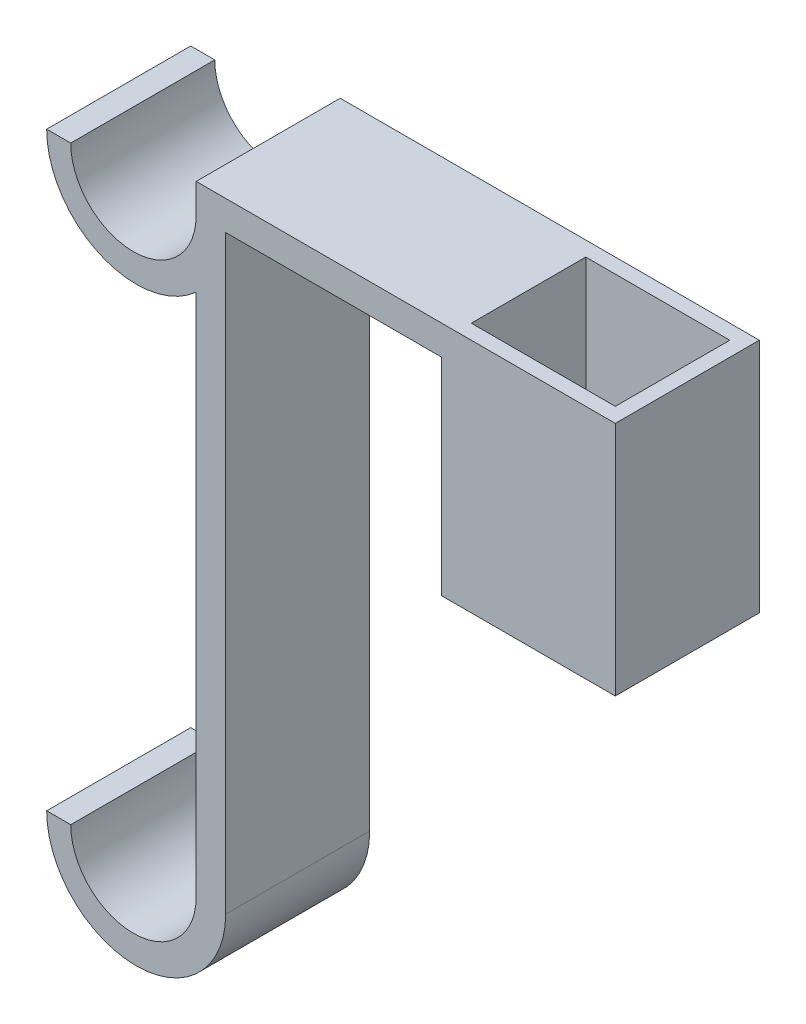
ISO-10303-21;
HEADER;
FILE_DESCRIPTION(('STEP AP214'),'2;1');
FILE_NAME('part.step','',(''),(''),'','','');
FILE_SCHEMA(('AUTOMOTIVE_DESIGN { 1 0 10303 214 1 1 1 1 }'));
ENDSEC;
DATA;
#1=APPLICATION_CONTEXT('core data for automotive mechanical design processes');
#2=APPLICATION_PROTOCOL_DEFINITION('international standard','automotive_design',2000,#1);
#3=PRODUCT_CONTEXT('',#1,'mechanical');
#4=PRODUCT('Part','Part','',(#3));
#5=PRODUCT_RELATED_PRODUCT_CATEGORY('part','',(#4));
#6=PRODUCT_DEFINITION_FORMATION('','',#4);
#7=PRODUCT_DEFINITION_CONTEXT('part definition',#1,'design');
#8=PRODUCT_DEFINITION('design','',#6,#7);
#9=PRODUCT_DEFINITION_SHAPE('','',#8);
#10=(LENGTH_UNIT() NAMED_UNIT(*) SI_UNIT(.MILLI.,.METRE.));
#11=(NAMED_UNIT(*) PLANE_ANGLE_UNIT() SI_UNIT($,.RADIAN.));
#12=(NAMED_UNIT(*) SI_UNIT($,.STERADIAN.) SOLID_ANGLE_UNIT());
#13=UNCERTAINTY_MEASURE_WITH_UNIT(LENGTH_MEASURE(1.E-05),#10,'distance_accuracy_value','');
#14=(GEOMETRIC_REPRESENTATION_CONTEXT(3) GLOBAL_UNCERTAINTY_ASSIGNED_CONTEXT((#13)) GLOBAL_UNIT_ASSIGNED_CONTEXT((#10,
#11,#12)) REPRESENTATION_CONTEXT('',''));
#15=CARTESIAN_POINT('',(0.,0.,0.));
#16=DIRECTION('',(0.,0.,1.));
#17=DIRECTION('',(1.,0.,0.));
#18=AXIS2_PLACEMENT_3D('',#15,#16,#17);
#19=CARTESIAN_POINT('',(-56.3,40.,12.2));
#20=DIRECTION('',(1.,0.,0.));
#21=DIRECTION('',(0.,0.,-1.));
#22=AXIS2_PLACEMENT_3D('',#19,#20,#21);
#23=PLANE('',#22);
#24=DIRECTION('',(0.,-1.,0.));
#25=VECTOR('',#24,1.);
#26=CARTESIAN_POINT('',(-56.3,40.,12.2));
#27=LINE('',#26,#25);
#28=CARTESIAN_POINT('',(-56.3,23.7472140240363,12.2));
#29=VERTEX_POINT('',#28);
#30=CARTESIAN_POINT('',(-56.3,-65.,12.2));
#31=VERTEX_POINT('',#30);
#32=EDGE_CURVE('E310',#29,#31,#27,.T.);
#33=ORIENTED_EDGE('',*,*,#32,.F.);
#34=DIRECTION('',(0.,0.,1.));
#35=VECTOR('',#34,1.);
#36=CARTESIAN_POINT('',(-56.3,23.7472140240363,-46.1044236907282));
#37=LINE('',#36,#35);
#38=CARTESIAN_POINT('',(-56.3,23.7472140240363,-12.2));
#39=VERTEX_POINT('',#38);
#40=EDGE_CURVE('E225',#29,#39,#37,.F.);
#41=ORIENTED_EDGE('',*,*,#40,.T.);
#42=DIRECTION('',(0.,-1.,0.));
#43=VECTOR('',#42,1.);
#44=CARTESIAN_POINT('',(-56.3,40.,-12.2));
#45=LINE('',#44,#43);
#46=CARTESIAN_POINT('',(-56.3,-65.,-12.2));
#47=VERTEX_POINT('',#46);
#48=EDGE_CURVE('E320',#39,#47,#45,.T.);
#49=ORIENTED_EDGE('',*,*,#48,.T.);
#50=DIRECTION('',(0.,0.,1.));
#51=VECTOR('',#50,1.);
#52=CARTESIAN_POINT('',(-56.3,-65.,-112.324921972504));
#53=LINE('',#52,#51);
#54=EDGE_CURVE('E286',#47,#31,#53,.T.);
#55=ORIENTED_EDGE('',*,*,#54,.T.);
#56=EDGE_LOOP('',(#33,#41,#49,#55));
#57=FACE_BOUND('',#56,.T.);
#58=ADVANCED_FACE('F39',(#57),#23,.F.);
#59=CARTESIAN_POINT('',(14.7,35.,12.2));
#60=DIRECTION('',(-1.,0.,0.));
#61=DIRECTION('',(0.,0.,1.));
#62=AXIS2_PLACEMENT_3D('',#59,#60,#61);
#63=PLANE('',#62);
#64=DIRECTION('',(0.,0.,-1.));
#65=VECTOR('',#64,1.);
#66=CARTESIAN_POINT('',(14.7,0.,12.2));
#67=LINE('',#66,#65);
#68=CARTESIAN_POINT('',(14.7,0.,12.2));
#69=VERTEX_POINT('',#68);
#70=CARTESIAN_POINT('',(14.7,0.,-12.2));
#71=VERTEX_POINT('',#70);
#72=EDGE_CURVE('E324',#69,#71,#67,.T.);
#73=ORIENTED_EDGE('',*,*,#72,.T.);
#74=DIRECTION('',(0.,-1.,0.));
#75=VECTOR('',#74,1.);
#76=CARTESIAN_POINT('',(14.7,35.,-12.2));
#77=LINE('',#76,#75);
#78=CARTESIAN_POINT('',(14.7,40.,-12.2));
#79=VERTEX_POINT('',#78);
#80=EDGE_CURVE('E11',#79,#71,#77,.T.);
#81=ORIENTED_EDGE('',*,*,#80,.F.);
#82=DIRECTION('',(0.,0.,-1.));
#83=VECTOR('',#82,1.);
#84=CARTESIAN_POINT('',(14.7,40.,12.2));
#85=LINE('',#84,#83);
#86=CARTESIAN_POINT('',(14.7,40.,12.2));
#87=VERTEX_POINT('',#86);
#88=EDGE_CURVE('E295',#87,#79,#85,.T.);
#89=ORIENTED_EDGE('',*,*,#88,.F.);
#90=DIRECTION('',(0.,-1.,0.));
#91=VECTOR('',#90,1.);
#92=CARTESIAN_POINT('',(14.7,35.,12.2));
#93=LINE('',#92,#91);
#94=EDGE_CURVE('E329',#87,#69,#93,.T.);
#95=ORIENTED_EDGE('',*,*,#94,.T.);
#96=EDGE_LOOP('',(#73,#81,#89,#95));
#97=FACE_BOUND('',#96,.T.);
#98=ADVANCED_FACE('F41',(#97),#63,.F.);
#99=CARTESIAN_POINT('',(-14.7,35.,-12.2));
#100=DIRECTION('',(0.,0.,1.));
#101=DIRECTION('',(1.,0.,0.));
#102=AXIS2_PLACEMENT_3D('',#99,#100,#101);
#103=PLANE('',#102);
#104=DIRECTION('',(-1.,0.,0.));
#105=VECTOR('',#104,1.);
#106=CARTESIAN_POINT('',(14.7,35.,-12.2));
#107=LINE('',#106,#105);
#108=CARTESIAN_POINT('',(-14.7,35.,-12.2));
#109=VERTEX_POINT('',#108);
#110=CARTESIAN_POINT('',(-51.3,35.,-12.2));
#111=VERTEX_POINT('',#110);
#112=EDGE_CURVE('E281',#109,#111,#107,.T.);
#113=ORIENTED_EDGE('',*,*,#112,.T.);
#114=DIRECTION('',(0.,-1.,0.));
#115=VECTOR('',#114,1.);
#116=CARTESIAN_POINT('',(-51.3,35.,-12.2));
#117=LINE('',#116,#115);
#118=CARTESIAN_POINT('',(-51.3,-65.,-12.2));
#119=VERTEX_POINT('',#118);
#120=EDGE_CURVE('E277',#111,#119,#117,.T.);
#121=ORIENTED_EDGE('',*,*,#120,.T.);
#122=CARTESIAN_POINT('',(-66.4625192220845,-65.,-12.2));
#123=DIRECTION('',(0.,0.,1.));
#124=DIRECTION('',(1.,0.,0.));
#125=AXIS2_PLACEMENT_3D('',#122,#123,#124);
#126=CIRCLE('',#125,15.1625192220845);
#127=CARTESIAN_POINT('',(-81.625038444169,-65.,-12.2));
#128=VERTEX_POINT('',#127);
#129=EDGE_CURVE('E249',#119,#128,#126,.F.);
#130=ORIENTED_EDGE('',*,*,#129,.T.);
#131=DIRECTION('',(1.,0.,0.));
#132=VECTOR('',#131,1.);
#133=CARTESIAN_POINT('',(-77.5511930153021,-65.,-12.2));
#134=LINE('',#133,#132);
#135=CARTESIAN_POINT('',(-77.5511930153021,-65.,-12.2));
#136=VERTEX_POINT('',#135);
#137=EDGE_CURVE('E257',#128,#136,#134,.T.);
#138=ORIENTED_EDGE('',*,*,#137,.T.);
#139=CARTESIAN_POINT('',(-66.925596507651,-65.,-12.2));
#140=DIRECTION('',(0.,0.,1.));
#141=DIRECTION('',(1.,0.,0.));
#142=AXIS2_PLACEMENT_3D('',#139,#140,#141);
#143=CIRCLE('',#142,10.625596507651);
#144=EDGE_CURVE('E252',#136,#47,#143,.T.);
#145=ORIENTED_EDGE('',*,*,#144,.T.);
#146=ORIENTED_EDGE('',*,*,#48,.F.);
#147=CARTESIAN_POINT('',(-66.4625192220845,35.,-12.2));
#148=DIRECTION('',(0.,0.,1.));
#149=DIRECTION('',(1.,0.,0.));
#150=AXIS2_PLACEMENT_3D('',#147,#148,#149);
#151=CIRCLE('',#150,15.1625192220845);
#152=CARTESIAN_POINT('',(-81.625038444169,35.,-12.2));
#153=VERTEX_POINT('',#152);
#154=EDGE_CURVE('E222',#39,#153,#151,.F.);
#155=ORIENTED_EDGE('',*,*,#154,.T.);
#156=DIRECTION('',(1.,0.,0.));
#157=VECTOR('',#156,1.);
#158=CARTESIAN_POINT('',(-81.625038444169,35.,-12.2));
#159=LINE('',#158,#157);
#160=CARTESIAN_POINT('',(-77.5511930153021,35.,-12.2));
#161=VERTEX_POINT('',#160);
#162=EDGE_CURVE('E218',#153,#161,#159,.T.);
#163=ORIENTED_EDGE('',*,*,#162,.T.);
#164=CARTESIAN_POINT('',(-66.925596507651,35.,-12.2));
#165=DIRECTION('',(0.,0.,1.));
#166=DIRECTION('',(1.,0.,0.));
#167=AXIS2_PLACEMENT_3D('',#164,#165,#166);
#168=CIRCLE('',#167,10.625596507651);
#169=CARTESIAN_POINT('',(-56.3,35.,-12.2));
#170=VERTEX_POINT('',#169);
#171=EDGE_CURVE('E214',#161,#170,#168,.T.);
#172=ORIENTED_EDGE('',*,*,#171,.T.);
#173=CARTESIAN_POINT('',(-56.3,40.,-12.2));
#174=VERTEX_POINT('',#173);
#175=EDGE_CURVE('E321',#174,#170,#45,.T.);
#176=ORIENTED_EDGE('',*,*,#175,.F.);
#177=DIRECTION('',(-1.,0.,0.));
#178=VECTOR('',#177,1.);
#179=CARTESIAN_POINT('',(14.7,40.,-12.2));
#180=LINE('',#179,#178);
#181=EDGE_CURVE('E299',#79,#174,#180,.T.);
#182=ORIENTED_EDGE('',*,*,#181,.F.);
#183=ORIENTED_EDGE('',*,*,#80,.T.);
#184=DIRECTION('',(-1.,0.,0.));
#185=VECTOR('',#184,1.);
#186=CARTESIAN_POINT('',(-14.7,0.,-12.2));
#187=LINE('',#186,#185);
#188=CARTESIAN_POINT('',(-14.7,0.,-12.2));
#189=VERTEX_POINT('',#188);
#190=EDGE_CURVE('E334',#71,#189,#187,.T.);
#191=ORIENTED_EDGE('',*,*,#190,.T.);
#192=DIRECTION('',(0.,-1.,0.));
#193=VECTOR('',#192,1.);
#194=CARTESIAN_POINT('',(-14.7,35.,-12.2));
#195=LINE('',#194,#193);
#196=EDGE_CURVE('E48',#109,#189,#195,.T.);
#197=ORIENTED_EDGE('',*,*,#196,.F.);
#198=EDGE_LOOP('',(#113,#121,#130,#138,#145,#146,#155,#163,#172,#176,#182,#183,#191,#197));
#199=FACE_BOUND('',#198,.T.);
#200=ADVANCED_FACE('F396',(#199),#103,.F.);
#201=CARTESIAN_POINT('',(-14.7,35.,12.2));
#202=DIRECTION('',(1.,0.,0.));
#203=DIRECTION('',(0.,0.,-1.));
#204=AXIS2_PLACEMENT_3D('',#201,#202,#203);
#205=PLANE('',#204);
#206=DIRECTION('',(0.,0.,1.));
#207=VECTOR('',#206,1.);
#208=CARTESIAN_POINT('',(-14.7,0.,12.2));
#209=LINE('',#208,#207);
#210=CARTESIAN_POINT('',(-14.7,0.,12.2));
#211=VERTEX_POINT('',#210);
#212=EDGE_CURVE('E337',#189,#211,#209,.T.);
#213=ORIENTED_EDGE('',*,*,#212,.T.);
#214=DIRECTION('',(0.,-1.,0.));
#215=VECTOR('',#214,1.);
#216=CARTESIAN_POINT('',(-14.7,35.,12.2));
#217=LINE('',#216,#215);
#218=CARTESIAN_POINT('',(-14.7,35.,12.2));
#219=VERTEX_POINT('',#218);
#220=EDGE_CURVE('E345',#219,#211,#217,.T.);
#221=ORIENTED_EDGE('',*,*,#220,.F.);
#222=DIRECTION('',(0.,0.,1.));
#223=VECTOR('',#222,1.);
#224=CARTESIAN_POINT('',(-14.7,35.,12.2));
#225=LINE('',#224,#223);
#226=EDGE_CURVE('E325',#109,#219,#225,.T.);
#227=ORIENTED_EDGE('',*,*,#226,.F.);
#228=ORIENTED_EDGE('',*,*,#196,.T.);
#229=EDGE_LOOP('',(#213,#221,#227,#228));
#230=FACE_BOUND('',#229,.T.);
#231=ADVANCED_FACE('F353',(#230),#205,.F.);
#232=CARTESIAN_POINT('',(-14.7,35.,12.2));
#233=DIRECTION('',(0.,0.,-1.));
#234=DIRECTION('',(-1.,0.,0.));
#235=AXIS2_PLACEMENT_3D('',#232,#233,#234);
#236=PLANE('',#235);
#237=CARTESIAN_POINT('',(-56.3,40.,12.2));
#238=VERTEX_POINT('',#237);
#239=CARTESIAN_POINT('',(-56.3,35.,12.2));
#240=VERTEX_POINT('',#239);
#241=EDGE_CURVE('E316',#238,#240,#27,.T.);
#242=ORIENTED_EDGE('',*,*,#241,.T.);
#243=CARTESIAN_POINT('',(-66.925596507651,35.,12.2));
#244=DIRECTION('',(0.,0.,-1.));
#245=DIRECTION('',(1.,0.,0.));
#246=AXIS2_PLACEMENT_3D('',#243,#244,#245);
#247=CIRCLE('',#246,10.625596507651);
#248=CARTESIAN_POINT('',(-77.5511930153021,35.,12.2));
#249=VERTEX_POINT('',#248);
#250=EDGE_CURVE('E229',#240,#249,#247,.T.);
#251=ORIENTED_EDGE('',*,*,#250,.T.);
#252=DIRECTION('',(-1.,0.,0.));
#253=VECTOR('',#252,1.);
#254=CARTESIAN_POINT('',(-81.625038444169,35.,12.2));
#255=LINE('',#254,#253);
#256=CARTESIAN_POINT('',(-81.625038444169,35.,12.2));
#257=VERTEX_POINT('',#256);
#258=EDGE_CURVE('E233',#249,#257,#255,.T.);
#259=ORIENTED_EDGE('',*,*,#258,.T.);
#260=CARTESIAN_POINT('',(-66.4625192220845,35.,12.2));
#261=DIRECTION('',(0.,0.,1.));
#262=DIRECTION('',(1.,0.,0.));
#263=AXIS2_PLACEMENT_3D('',#260,#261,#262);
#264=CIRCLE('',#263,15.1625192220845);
#265=EDGE_CURVE('E213',#257,#29,#264,.T.);
#266=ORIENTED_EDGE('',*,*,#265,.T.);
#267=ORIENTED_EDGE('',*,*,#32,.T.);
#268=CARTESIAN_POINT('',(-66.925596507651,-65.,12.2));
#269=DIRECTION('',(0.,0.,-1.));
#270=DIRECTION('',(1.,0.,0.));
#271=AXIS2_PLACEMENT_3D('',#268,#269,#270);
#272=CIRCLE('',#271,10.625596507651);
#273=CARTESIAN_POINT('',(-77.5511930153021,-65.,12.2));
#274=VERTEX_POINT('',#273);
#275=EDGE_CURVE('E248',#31,#274,#272,.T.);
#276=ORIENTED_EDGE('',*,*,#275,.T.);
#277=DIRECTION('',(-1.,0.,0.));
#278=VECTOR('',#277,1.);
#279=CARTESIAN_POINT('',(-77.5511930153021,-65.,12.2));
#280=LINE('',#279,#278);
#281=CARTESIAN_POINT('',(-81.625038444169,-65.,12.2));
#282=VERTEX_POINT('',#281);
#283=EDGE_CURVE('E261',#274,#282,#280,.T.);
#284=ORIENTED_EDGE('',*,*,#283,.T.);
#285=CARTESIAN_POINT('',(-66.4625192220845,-65.,12.2));
#286=DIRECTION('',(0.,0.,1.));
#287=DIRECTION('',(1.,0.,0.));
#288=AXIS2_PLACEMENT_3D('',#285,#286,#287);
#289=CIRCLE('',#288,15.1625192220845);
#290=CARTESIAN_POINT('',(-51.3,-65.,12.2));
#291=VERTEX_POINT('',#290);
#292=EDGE_CURVE('E265',#282,#291,#289,.T.);
#293=ORIENTED_EDGE('',*,*,#292,.T.);
#294=DIRECTION('',(0.,1.,0.));
#295=VECTOR('',#294,1.);
#296=CARTESIAN_POINT('',(-51.3,35.,12.2));
#297=LINE('',#296,#295);
#298=CARTESIAN_POINT('',(-51.3,35.,12.2));
#299=VERTEX_POINT('',#298);
#300=EDGE_CURVE('E276',#291,#299,#297,.T.);
#301=ORIENTED_EDGE('',*,*,#300,.T.);
#302=DIRECTION('',(1.,0.,0.));
#303=VECTOR('',#302,1.);
#304=CARTESIAN_POINT('',(14.7,35.,12.2));
#305=LINE('',#304,#303);
#306=EDGE_CURVE('E300',#299,#219,#305,.T.);
#307=ORIENTED_EDGE('',*,*,#306,.T.);
#308=ORIENTED_EDGE('',*,*,#220,.T.);
#309=DIRECTION('',(1.,0.,0.));
#310=VECTOR('',#309,1.);
#311=CARTESIAN_POINT('',(-14.7,0.,12.2));
#312=LINE('',#311,#310);
#313=EDGE_CURVE('E330',#211,#69,#312,.T.);
#314=ORIENTED_EDGE('',*,*,#313,.T.);
#315=ORIENTED_EDGE('',*,*,#94,.F.);
#316=DIRECTION('',(1.,0.,0.));
#317=VECTOR('',#316,1.);
#318=CARTESIAN_POINT('',(14.7,40.,12.2));
#319=LINE('',#318,#317);
#320=EDGE_CURVE('E306',#238,#87,#319,.T.);
#321=ORIENTED_EDGE('',*,*,#320,.F.);
#322=EDGE_LOOP('',(#242,#251,#259,#266,#267,#276,#284,#293,#301,#307,#308,#314,#315,#321));
#323=FACE_BOUND('',#322,.T.);
#324=ADVANCED_FACE('F362',(#323),#236,.F.);
#325=CARTESIAN_POINT('',(0.,0.,0.));
#326=DIRECTION('',(0.,-1.,0.));
#327=DIRECTION('',(0.,0.,-1.));
#328=AXIS2_PLACEMENT_3D('',#325,#326,#327);
#329=PLANE('',#328);
#330=DIRECTION('',(0.,0.,1.));
#331=VECTOR('',#330,1.);
#332=CARTESIAN_POINT('',(12.2,0.,0.));
#333=LINE('',#332,#331);
#334=CARTESIAN_POINT('',(12.2,0.,-9.7));
#335=VERTEX_POINT('',#334);
#336=CARTESIAN_POINT('',(12.2,0.,9.7));
#337=VERTEX_POINT('',#336);
#338=EDGE_CURVE('E171',#335,#337,#333,.T.);
#339=ORIENTED_EDGE('',*,*,#338,.F.);
#340=DIRECTION('',(1.,0.,0.));
#341=VECTOR('',#340,1.);
#342=CARTESIAN_POINT('',(0.,0.,-9.7));
#343=LINE('',#342,#341);
#344=CARTESIAN_POINT('',(-12.2,0.,-9.7));
#345=VERTEX_POINT('',#344);
#346=EDGE_CURVE('E208',#345,#335,#343,.T.);
#347=ORIENTED_EDGE('',*,*,#346,.F.);
#348=DIRECTION('',(0.,0.,-1.));
#349=VECTOR('',#348,1.);
#350=CARTESIAN_POINT('',(-12.2,0.,0.));
#351=LINE('',#350,#349);
#352=CARTESIAN_POINT('',(-12.2,0.,9.7));
#353=VERTEX_POINT('',#352);
#354=EDGE_CURVE('E205',#353,#345,#351,.T.);
#355=ORIENTED_EDGE('',*,*,#354,.F.);
#356=DIRECTION('',(-1.,0.,0.));
#357=VECTOR('',#356,1.);
#358=CARTESIAN_POINT('',(0.,0.,9.7));
#359=LINE('',#358,#357);
#360=EDGE_CURVE('E196',#337,#353,#359,.T.);
#361=ORIENTED_EDGE('',*,*,#360,.F.);
#362=EDGE_LOOP('',(#339,#347,#355,#361));
#363=FACE_BOUND('',#362,.T.);
#364=ORIENTED_EDGE('',*,*,#72,.F.);
#365=ORIENTED_EDGE('',*,*,#313,.F.);
#366=ORIENTED_EDGE('',*,*,#212,.F.);
#367=ORIENTED_EDGE('',*,*,#190,.F.);
#368=EDGE_LOOP('',(#364,#365,#366,#367));
#369=FACE_BOUND('',#368,.T.);
#370=ADVANCED_FACE('F360',(#363,#369),#329,.T.);
#371=CARTESIAN_POINT('',(0.,35.,0.));
#372=DIRECTION('',(0.,1.,0.));
#373=DIRECTION('',(0.,0.,1.));
#374=AXIS2_PLACEMENT_3D('',#371,#372,#373);
#375=PLANE('',#374);
#376=ORIENTED_EDGE('',*,*,#306,.F.);
#377=DIRECTION('',(0.,0.,1.));
#378=VECTOR('',#377,1.);
#379=CARTESIAN_POINT('',(-51.3,35.,-112.324921972504));
#380=LINE('',#379,#378);
#381=EDGE_CURVE('E282',#111,#299,#380,.T.);
#382=ORIENTED_EDGE('',*,*,#381,.F.);
#383=ORIENTED_EDGE('',*,*,#112,.F.);
#384=ORIENTED_EDGE('',*,*,#226,.T.);
#385=EDGE_LOOP('',(#376,#382,#383,#384));
#386=FACE_BOUND('',#385,.T.);
#387=ADVANCED_FACE('F411',(#386),#375,.F.);
#388=ORIENTED_EDGE('',*,*,#175,.T.);
#389=DIRECTION('',(0.,0.,1.));
#390=VECTOR('',#389,1.);
#391=CARTESIAN_POINT('',(-56.3,35.,-46.1044236907282));
#392=LINE('',#391,#390);
#393=EDGE_CURVE('E237',#170,#240,#392,.T.);
#394=ORIENTED_EDGE('',*,*,#393,.T.);
#395=ORIENTED_EDGE('',*,*,#241,.F.);
#396=DIRECTION('',(0.,0.,1.));
#397=VECTOR('',#396,1.);
#398=CARTESIAN_POINT('',(-56.3,40.,12.2));
#399=LINE('',#398,#397);
#400=EDGE_CURVE('E303',#174,#238,#399,.T.);
#401=ORIENTED_EDGE('',*,*,#400,.F.);
#402=EDGE_LOOP('',(#388,#394,#395,#401));
#403=FACE_BOUND('',#402,.T.);
#404=ADVANCED_FACE('F413',(#403),#23,.F.);
#405=CARTESIAN_POINT('',(0.,40.,0.));
#406=DIRECTION('',(0.,1.,0.));
#407=DIRECTION('',(0.,0.,1.));
#408=AXIS2_PLACEMENT_3D('',#405,#406,#407);
#409=PLANE('',#408);
#410=DIRECTION('',(0.,0.,1.));
#411=VECTOR('',#410,1.);
#412=CARTESIAN_POINT('',(12.2,40.,9.7));
#413=LINE('',#412,#411);
#414=CARTESIAN_POINT('',(12.2,40.,-9.7));
#415=VERTEX_POINT('',#414);
#416=CARTESIAN_POINT('',(12.2,40.,9.7));
#417=VERTEX_POINT('',#416);
#418=EDGE_CURVE('E168',#415,#417,#413,.T.);
#419=ORIENTED_EDGE('',*,*,#418,.T.);
#420=DIRECTION('',(-1.,0.,0.));
#421=VECTOR('',#420,1.);
#422=CARTESIAN_POINT('',(-12.2,40.,9.7));
#423=LINE('',#422,#421);
#424=CARTESIAN_POINT('',(-12.2,40.,9.7));
#425=VERTEX_POINT('',#424);
#426=EDGE_CURVE('E178',#417,#425,#423,.T.);
#427=ORIENTED_EDGE('',*,*,#426,.T.);
#428=DIRECTION('',(0.,0.,-1.));
#429=VECTOR('',#428,1.);
#430=CARTESIAN_POINT('',(-12.2,40.,9.7));
#431=LINE('',#430,#429);
#432=CARTESIAN_POINT('',(-12.2,40.,-9.7));
#433=VERTEX_POINT('',#432);
#434=EDGE_CURVE('E63',#425,#433,#431,.T.);
#435=ORIENTED_EDGE('',*,*,#434,.T.);
#436=DIRECTION('',(1.,0.,0.));
#437=VECTOR('',#436,1.);
#438=CARTESIAN_POINT('',(-12.2,40.,-9.7));
#439=LINE('',#438,#437);
#440=EDGE_CURVE('E175',#433,#415,#439,.T.);
#441=ORIENTED_EDGE('',*,*,#440,.T.);
#442=EDGE_LOOP('',(#419,#427,#435,#441));
#443=FACE_BOUND('',#442,.T.);
#444=ORIENTED_EDGE('',*,*,#88,.T.);
#445=ORIENTED_EDGE('',*,*,#181,.T.);
#446=ORIENTED_EDGE('',*,*,#400,.T.);
#447=ORIENTED_EDGE('',*,*,#320,.T.);
#448=EDGE_LOOP('',(#444,#445,#446,#447));
#449=FACE_BOUND('',#448,.T.);
#450=ADVANCED_FACE('F183',(#443,#449),#409,.T.);
#451=CARTESIAN_POINT('',(-51.3,35.,-112.324921972504));
#452=DIRECTION('',(1.,0.,0.));
#453=DIRECTION('',(0.,1.,0.));
#454=AXIS2_PLACEMENT_3D('',#451,#452,#453);
#455=PLANE('',#454);
#456=ORIENTED_EDGE('',*,*,#120,.F.);
#457=ORIENTED_EDGE('',*,*,#381,.T.);
#458=ORIENTED_EDGE('',*,*,#300,.F.);
#459=DIRECTION('',(0.,0.,1.));
#460=VECTOR('',#459,1.);
#461=CARTESIAN_POINT('',(-51.3,-65.,-112.324921972504));
#462=LINE('',#461,#460);
#463=EDGE_CURVE('E289',#119,#291,#462,.T.);
#464=ORIENTED_EDGE('',*,*,#463,.F.);
#465=EDGE_LOOP('',(#456,#457,#458,#464));
#466=FACE_BOUND('',#465,.T.);
#467=ADVANCED_FACE('F408',(#466),#455,.T.);
#468=CARTESIAN_POINT('',(-66.925596507651,-65.,-46.1044236907282));
#469=DIRECTION('',(0.,0.,1.));
#470=DIRECTION('',(1.,0.,0.));
#471=AXIS2_PLACEMENT_3D('',#468,#469,#470);
#472=CYLINDRICAL_SURFACE('',#471,10.625596507651);
#473=ORIENTED_EDGE('',*,*,#144,.F.);
#474=DIRECTION('',(0.,0.,1.));
#475=VECTOR('',#474,1.);
#476=CARTESIAN_POINT('',(-77.5511930153021,-65.,-46.1044236907282));
#477=LINE('',#476,#475);
#478=EDGE_CURVE('E269',#136,#274,#477,.T.);
#479=ORIENTED_EDGE('',*,*,#478,.T.);
#480=ORIENTED_EDGE('',*,*,#275,.F.);
#481=ORIENTED_EDGE('',*,*,#54,.F.);
#482=EDGE_LOOP('',(#473,#479,#480,#481));
#483=FACE_BOUND('',#482,.T.);
#484=ADVANCED_FACE('F394',(#483),#472,.F.);
#485=CARTESIAN_POINT('',(-66.4625192220845,-65.,-46.1044236907282));
#486=DIRECTION('',(0.,0.,1.));
#487=DIRECTION('',(1.,0.,0.));
#488=AXIS2_PLACEMENT_3D('',#485,#486,#487);
#489=CYLINDRICAL_SURFACE('',#488,15.1625192220845);
#490=ORIENTED_EDGE('',*,*,#129,.F.);
#491=ORIENTED_EDGE('',*,*,#463,.T.);
#492=ORIENTED_EDGE('',*,*,#292,.F.);
#493=DIRECTION('',(0.,0.,1.));
#494=VECTOR('',#493,1.);
#495=CARTESIAN_POINT('',(-81.625038444169,-65.,-46.1044236907282));
#496=LINE('',#495,#494);
#497=EDGE_CURVE('E253',#128,#282,#496,.T.);
#498=ORIENTED_EDGE('',*,*,#497,.F.);
#499=EDGE_LOOP('',(#490,#491,#492,#498));
#500=FACE_BOUND('',#499,.T.);
#501=ADVANCED_FACE('F511',(#500),#489,.T.);
#502=CARTESIAN_POINT('',(-77.5511930153021,-65.,-46.1044236907282));
#503=DIRECTION('',(0.,1.,0.));
#504=DIRECTION('',(-1.,0.,0.));
#505=AXIS2_PLACEMENT_3D('',#502,#503,#504);
#506=PLANE('',#505);
#507=ORIENTED_EDGE('',*,*,#137,.F.);
#508=ORIENTED_EDGE('',*,*,#497,.T.);
#509=ORIENTED_EDGE('',*,*,#283,.F.);
#510=ORIENTED_EDGE('',*,*,#478,.F.);
#511=EDGE_LOOP('',(#507,#508,#509,#510));
#512=FACE_BOUND('',#511,.T.);
#513=ADVANCED_FACE('F400',(#512),#506,.T.);
#514=CARTESIAN_POINT('',(-66.4625192220845,35.,-46.1044236907282));
#515=DIRECTION('',(0.,0.,1.));
#516=DIRECTION('',(1.,0.,0.));
#517=AXIS2_PLACEMENT_3D('',#514,#515,#516);
#518=CYLINDRICAL_SURFACE('',#517,15.1625192220845);
#519=ORIENTED_EDGE('',*,*,#40,.F.);
#520=ORIENTED_EDGE('',*,*,#265,.F.);
#521=DIRECTION('',(0.,0.,1.));
#522=VECTOR('',#521,1.);
#523=CARTESIAN_POINT('',(-81.625038444169,35.,-46.1044236907282));
#524=LINE('',#523,#522);
#525=EDGE_CURVE('E219',#153,#257,#524,.T.);
#526=ORIENTED_EDGE('',*,*,#525,.F.);
#527=ORIENTED_EDGE('',*,*,#154,.F.);
#528=EDGE_LOOP('',(#519,#520,#526,#527));
#529=FACE_BOUND('',#528,.T.);
#530=ADVANCED_FACE('F386',(#529),#518,.T.);
#531=CARTESIAN_POINT('',(-81.625038444169,35.,-46.1044236907282));
#532=DIRECTION('',(0.,1.,0.));
#533=DIRECTION('',(-1.,0.,0.));
#534=AXIS2_PLACEMENT_3D('',#531,#532,#533);
#535=PLANE('',#534);
#536=ORIENTED_EDGE('',*,*,#162,.F.);
#537=ORIENTED_EDGE('',*,*,#525,.T.);
#538=ORIENTED_EDGE('',*,*,#258,.F.);
#539=DIRECTION('',(0.,0.,1.));
#540=VECTOR('',#539,1.);
#541=CARTESIAN_POINT('',(-77.5511930153021,35.,-46.1044236907282));
#542=LINE('',#541,#540);
#543=EDGE_CURVE('E240',#161,#249,#542,.T.);
#544=ORIENTED_EDGE('',*,*,#543,.F.);
#545=EDGE_LOOP('',(#536,#537,#538,#544));
#546=FACE_BOUND('',#545,.T.);
#547=ADVANCED_FACE('F380',(#546),#535,.T.);
#548=CARTESIAN_POINT('',(-66.925596507651,35.,-46.1044236907282));
#549=DIRECTION('',(0.,0.,1.));
#550=DIRECTION('',(1.,0.,0.));
#551=AXIS2_PLACEMENT_3D('',#548,#549,#550);
#552=CYLINDRICAL_SURFACE('',#551,10.625596507651);
#553=ORIENTED_EDGE('',*,*,#171,.F.);
#554=ORIENTED_EDGE('',*,*,#543,.T.);
#555=ORIENTED_EDGE('',*,*,#250,.F.);
#556=ORIENTED_EDGE('',*,*,#393,.F.);
#557=EDGE_LOOP('',(#553,#554,#555,#556));
#558=FACE_BOUND('',#557,.T.);
#559=ADVANCED_FACE('F376',(#558),#552,.F.);
#560=CARTESIAN_POINT('',(12.2,40.,9.7));
#561=DIRECTION('',(1.,0.,0.));
#562=DIRECTION('',(0.,0.,-1.));
#563=AXIS2_PLACEMENT_3D('',#560,#561,#562);
#564=PLANE('',#563);
#565=ORIENTED_EDGE('',*,*,#338,.T.);
#566=DIRECTION('',(0.,-1.,0.));
#567=VECTOR('',#566,1.);
#568=CARTESIAN_POINT('',(12.2,40.,9.7));
#569=LINE('',#568,#567);
#570=EDGE_CURVE('E55',#417,#337,#569,.T.);
#571=ORIENTED_EDGE('',*,*,#570,.F.);
#572=ORIENTED_EDGE('',*,*,#418,.F.);
#573=DIRECTION('',(0.,-1.,0.));
#574=VECTOR('',#573,1.);
#575=CARTESIAN_POINT('',(12.2,40.,-9.7));
#576=LINE('',#575,#574);
#577=EDGE_CURVE('E193',#415,#335,#576,.T.);
#578=ORIENTED_EDGE('',*,*,#577,.T.);
#579=EDGE_LOOP('',(#565,#571,#572,#578));
#580=FACE_BOUND('',#579,.T.);
#581=ADVANCED_FACE('F165',(#580),#564,.F.);
#582=CARTESIAN_POINT('',(-12.2,40.,-9.7));
#583=DIRECTION('',(0.,0.,-1.));
#584=DIRECTION('',(-1.,0.,0.));
#585=AXIS2_PLACEMENT_3D('',#582,#583,#584);
#586=PLANE('',#585);
#587=ORIENTED_EDGE('',*,*,#346,.T.);
#588=ORIENTED_EDGE('',*,*,#577,.F.);
#589=ORIENTED_EDGE('',*,*,#440,.F.);
#590=DIRECTION('',(0.,-1.,0.));
#591=VECTOR('',#590,1.);
#592=CARTESIAN_POINT('',(-12.2,40.,-9.7));
#593=LINE('',#592,#591);
#594=EDGE_CURVE('E197',#433,#345,#593,.T.);
#595=ORIENTED_EDGE('',*,*,#594,.T.);
#596=EDGE_LOOP('',(#587,#588,#589,#595));
#597=FACE_BOUND('',#596,.T.);
#598=ADVANCED_FACE('F475',(#597),#586,.F.);
#599=CARTESIAN_POINT('',(-12.2,40.,9.7));
#600=DIRECTION('',(-1.,0.,0.));
#601=DIRECTION('',(0.,0.,1.));
#602=AXIS2_PLACEMENT_3D('',#599,#600,#601);
#603=PLANE('',#602);
#604=ORIENTED_EDGE('',*,*,#354,.T.);
#605=ORIENTED_EDGE('',*,*,#594,.F.);
#606=ORIENTED_EDGE('',*,*,#434,.F.);
#607=DIRECTION('',(0.,-1.,0.));
#608=VECTOR('',#607,1.);
#609=CARTESIAN_POINT('',(-12.2,40.,9.7));
#610=LINE('',#609,#608);
#611=EDGE_CURVE('E174',#425,#353,#610,.T.);
#612=ORIENTED_EDGE('',*,*,#611,.T.);
#613=EDGE_LOOP('',(#604,#605,#606,#612));
#614=FACE_BOUND('',#613,.T.);
#615=ADVANCED_FACE('F484',(#614),#603,.F.);
#616=CARTESIAN_POINT('',(-12.2,40.,9.7));
#617=DIRECTION('',(0.,0.,1.));
#618=DIRECTION('',(1.,0.,0.));
#619=AXIS2_PLACEMENT_3D('',#616,#617,#618);
#620=PLANE('',#619);
#621=ORIENTED_EDGE('',*,*,#360,.T.);
#622=ORIENTED_EDGE('',*,*,#611,.F.);
#623=ORIENTED_EDGE('',*,*,#426,.F.);
#624=ORIENTED_EDGE('',*,*,#570,.T.);
#625=EDGE_LOOP('',(#621,#622,#623,#624));
#626=FACE_BOUND('',#625,.T.);
#627=ADVANCED_FACE('F179',(#626),#620,.F.);
#628=CLOSED_SHELL('',(#58,#98,#200,#231,#324,#370,#387,#404,#450,#467,#484,#501,#513,#530,#547,
#559,#581,#598,#615,#627));
#629=MANIFOLD_SOLID_BREP('B2',#628);
#630=ADVANCED_BREP_SHAPE_REPRESENTATION('',(#18,#629),#14);
#631=SHAPE_DEFINITION_REPRESENTATION(#9,#630);
ENDSEC;
END-ISO-10303-21;
